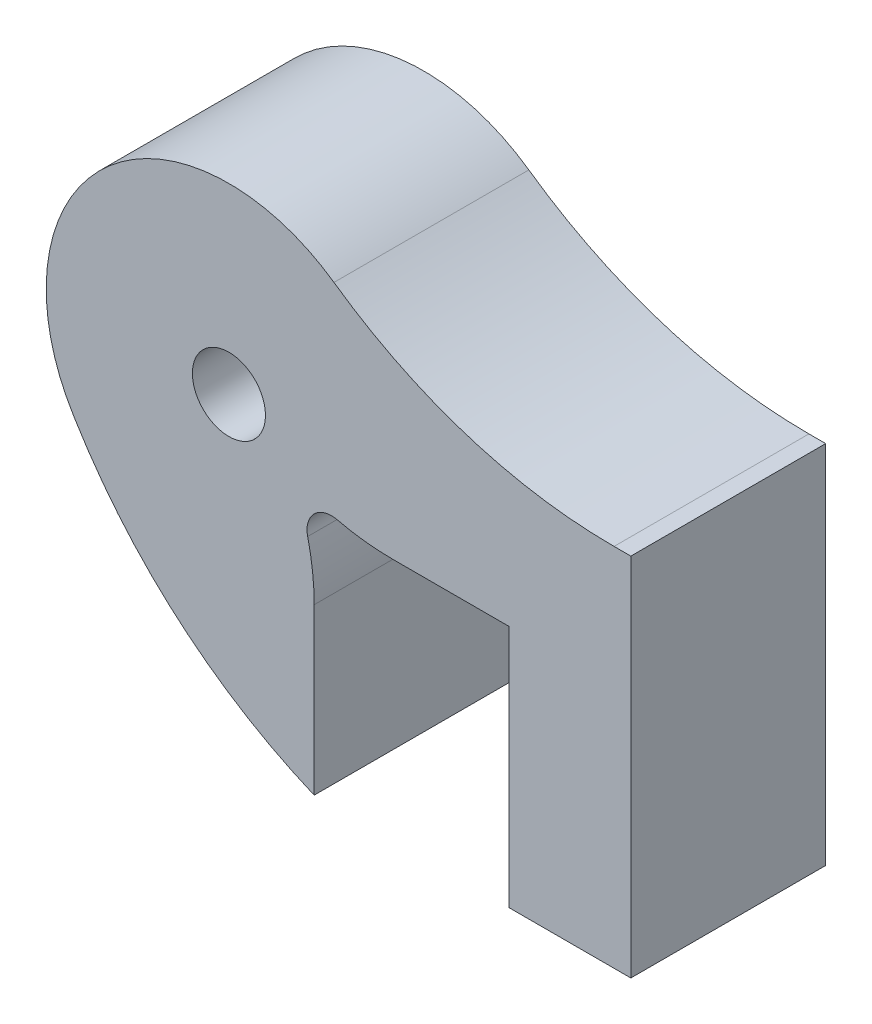
ISO-10303-21;
HEADER;
FILE_DESCRIPTION(('STEP AP214'),'2;1');
FILE_NAME('part.step','',(''),(''),'','','');
FILE_SCHEMA(('AUTOMOTIVE_DESIGN { 1 0 10303 214 1 1 1 1 }'));
ENDSEC;
DATA;
#1=APPLICATION_CONTEXT('core data for automotive mechanical design processes');
#2=APPLICATION_PROTOCOL_DEFINITION('international standard','automotive_design',2000,#1);
#3=PRODUCT_CONTEXT('',#1,'mechanical');
#4=PRODUCT('Part','Part','',(#3));
#5=PRODUCT_RELATED_PRODUCT_CATEGORY('part','',(#4));
#6=PRODUCT_DEFINITION_FORMATION('','',#4);
#7=PRODUCT_DEFINITION_CONTEXT('part definition',#1,'design');
#8=PRODUCT_DEFINITION('design','',#6,#7);
#9=PRODUCT_DEFINITION_SHAPE('','',#8);
#10=(LENGTH_UNIT() NAMED_UNIT(*) SI_UNIT(.MILLI.,.METRE.));
#11=(NAMED_UNIT(*) PLANE_ANGLE_UNIT() SI_UNIT($,.RADIAN.));
#12=(NAMED_UNIT(*) SI_UNIT($,.STERADIAN.) SOLID_ANGLE_UNIT());
#13=UNCERTAINTY_MEASURE_WITH_UNIT(LENGTH_MEASURE(1.E-05),#10,'distance_accuracy_value','');
#14=(GEOMETRIC_REPRESENTATION_CONTEXT(3) GLOBAL_UNCERTAINTY_ASSIGNED_CONTEXT((#13)) GLOBAL_UNIT_ASSIGNED_CONTEXT((#10,
#11,#12)) REPRESENTATION_CONTEXT('',''));
#15=CARTESIAN_POINT('',(0.,0.,0.));
#16=DIRECTION('',(0.,0.,1.));
#17=DIRECTION('',(1.,0.,0.));
#18=AXIS2_PLACEMENT_3D('',#15,#16,#17);
#19=CARTESIAN_POINT('',(20.,15.,8.));
#20=DIRECTION('',(0.,0.,1.));
#21=DIRECTION('',(1.,0.,0.));
#22=AXIS2_PLACEMENT_3D('',#19,#20,#21);
#23=PLANE('',#22);
#24=CARTESIAN_POINT('',(-19.9060472234872,-1.93630677742358,8.));
#25=DIRECTION('',(0.,0.,1.));
#26=DIRECTION('',(1.,0.,0.));
#27=AXIS2_PLACEMENT_3D('',#24,#25,#26);
#28=CIRCLE('',#27,20.);
#29=CARTESIAN_POINT('',(-2.88346742458743,8.56282542433902,8.));
#30=VERTEX_POINT('',#29);
#31=CARTESIAN_POINT('',(-2.81678935009272,8.4539417921066,8.));
#32=VERTEX_POINT('',#31);
#33=EDGE_CURVE('E203',#30,#32,#28,.F.);
#34=ORIENTED_EDGE('',*,*,#33,.T.);
#35=CARTESIAN_POINT('',(15.1269314169715,19.3637027901133,8.));
#36=DIRECTION('',(0.,0.,1.));
#37=DIRECTION('',(1.,0.,0.));
#38=AXIS2_PLACEMENT_3D('',#35,#36,#37);
#39=CIRCLE('',#38,21.);
#40=CARTESIAN_POINT('',(7.,0.,8.));
#41=VERTEX_POINT('',#40);
#42=EDGE_CURVE('E12',#32,#41,#39,.T.);
#43=ORIENTED_EDGE('',*,*,#42,.T.);
#44=DIRECTION('',(0.,1.,0.));
#45=VECTOR('',#44,1.);
#46=CARTESIAN_POINT('',(7.,0.,8.));
#47=LINE('',#46,#45);
#48=CARTESIAN_POINT('',(7.,6.77141262672688,8.));
#49=VERTEX_POINT('',#48);
#50=EDGE_CURVE('E153',#41,#49,#47,.T.);
#51=ORIENTED_EDGE('',*,*,#50,.T.);
#52=CARTESIAN_POINT('',(-3.,6.77141262672688,8.));
#53=DIRECTION('',(0.,0.,1.));
#54=DIRECTION('',(1.,0.,0.));
#55=AXIS2_PLACEMENT_3D('',#52,#53,#54);
#56=CIRCLE('',#55,10.);
#57=CARTESIAN_POINT('',(6.73373343744231,9.06366771044194,8.));
#58=VERTEX_POINT('',#57);
#59=EDGE_CURVE('E180',#49,#58,#56,.T.);
#60=ORIENTED_EDGE('',*,*,#59,.T.);
#61=CARTESIAN_POINT('',(7.70710678118654,9.29289321881345,8.));
#62=DIRECTION('',(0.,0.,1.));
#63=DIRECTION('',(1.,0.,0.));
#64=AXIS2_PLACEMENT_3D('',#61,#62,#63);
#65=CIRCLE('',#64,1.);
#66=CARTESIAN_POINT('',(7.93633228955805,10.2662665625577,8.));
#67=VERTEX_POINT('',#66);
#68=EDGE_CURVE('E219',#67,#58,#65,.T.);
#69=ORIENTED_EDGE('',*,*,#68,.F.);
#70=CARTESIAN_POINT('',(10.2285873732731,20.,8.));
#71=DIRECTION('',(0.,0.,1.));
#72=DIRECTION('',(1.,0.,0.));
#73=AXIS2_PLACEMENT_3D('',#70,#71,#72);
#74=CIRCLE('',#73,10.);
#75=CARTESIAN_POINT('',(10.2285873732731,10.,8.));
#76=VERTEX_POINT('',#75);
#77=EDGE_CURVE('E172',#67,#76,#74,.T.);
#78=ORIENTED_EDGE('',*,*,#77,.T.);
#79=DIRECTION('',(1.,0.,0.));
#80=VECTOR('',#79,1.);
#81=CARTESIAN_POINT('',(15.,10.,8.));
#82=LINE('',#81,#80);
#83=CARTESIAN_POINT('',(15.,10.,8.));
#84=VERTEX_POINT('',#83);
#85=EDGE_CURVE('E264',#76,#84,#82,.T.);
#86=ORIENTED_EDGE('',*,*,#85,.T.);
#87=DIRECTION('',(0.,-1.,0.));
#88=VECTOR('',#87,1.);
#89=CARTESIAN_POINT('',(15.,0.,8.));
#90=LINE('',#89,#88);
#91=CARTESIAN_POINT('',(15.,0.,8.));
#92=VERTEX_POINT('',#91);
#93=EDGE_CURVE('E256',#84,#92,#90,.T.);
#94=ORIENTED_EDGE('',*,*,#93,.T.);
#95=DIRECTION('',(1.,0.,0.));
#96=VECTOR('',#95,1.);
#97=CARTESIAN_POINT('',(20.,0.,8.));
#98=LINE('',#97,#96);
#99=CARTESIAN_POINT('',(20.,0.,8.));
#100=VERTEX_POINT('',#99);
#101=EDGE_CURVE('E159',#92,#100,#98,.T.);
#102=ORIENTED_EDGE('',*,*,#101,.T.);
#103=DIRECTION('',(0.,1.,0.));
#104=VECTOR('',#103,1.);
#105=CARTESIAN_POINT('',(20.,0.,8.));
#106=LINE('',#105,#104);
#107=CARTESIAN_POINT('',(20.,15.,8.));
#108=VERTEX_POINT('',#107);
#109=EDGE_CURVE('E154',#100,#108,#106,.T.);
#110=ORIENTED_EDGE('',*,*,#109,.T.);
#111=DIRECTION('',(-1.,0.,0.));
#112=VECTOR('',#111,1.);
#113=CARTESIAN_POINT('',(20.,15.,8.));
#114=LINE('',#113,#112);
#115=CARTESIAN_POINT('',(19.3113883008419,15.,8.));
#116=VERTEX_POINT('',#115);
#117=EDGE_CURVE('E143',#108,#116,#114,.T.);
#118=ORIENTED_EDGE('',*,*,#117,.T.);
#119=CARTESIAN_POINT('',(19.3113883008419,35.,8.));
#120=DIRECTION('',(0.,0.,1.));
#121=DIRECTION('',(1.,0.,0.));
#122=AXIS2_PLACEMENT_3D('',#119,#120,#121);
#123=CIRCLE('',#122,20.);
#124=CARTESIAN_POINT('',(7.81219680932051,18.6363636363636,8.));
#125=VERTEX_POINT('',#124);
#126=EDGE_CURVE('E199',#116,#125,#123,.F.);
#127=ORIENTED_EDGE('',*,*,#126,.T.);
#128=CARTESIAN_POINT('',(3.5,12.5,8.));
#129=DIRECTION('',(0.,0.,1.));
#130=DIRECTION('',(1.,0.,0.));
#131=AXIS2_PLACEMENT_3D('',#128,#129,#130);
#132=CIRCLE('',#131,7.5);
#133=EDGE_CURVE('E220',#125,#30,#132,.T.);
#134=ORIENTED_EDGE('',*,*,#133,.T.);
#135=EDGE_LOOP('',(#34,#43,#51,#60,#69,#78,#86,#94,#102,#110,#118,#127,#134));
#136=FACE_BOUND('',#135,.T.);
#137=CARTESIAN_POINT('',(3.5,12.5,8.));
#138=DIRECTION('',(0.,0.,1.));
#139=DIRECTION('',(1.,0.,0.));
#140=AXIS2_PLACEMENT_3D('',#137,#138,#139);
#141=CIRCLE('',#140,1.5);
#142=CARTESIAN_POINT('',(5.,12.5,8.));
#143=VERTEX_POINT('',#142);
#144=EDGE_CURVE('E267',#143,#143,#141,.T.);
#145=ORIENTED_EDGE('',*,*,#144,.F.);
#146=EDGE_LOOP('',(#145));
#147=FACE_BOUND('',#146,.T.);
#148=ADVANCED_FACE('F49',(#136,#147),#23,.T.);
#149=CARTESIAN_POINT('',(20.,15.,0.));
#150=DIRECTION('',(0.,0.,1.));
#151=DIRECTION('',(1.,0.,0.));
#152=AXIS2_PLACEMENT_3D('',#149,#150,#151);
#153=PLANE('',#152);
#154=DIRECTION('',(0.,1.,0.));
#155=VECTOR('',#154,1.);
#156=CARTESIAN_POINT('',(7.,0.,0.));
#157=LINE('',#156,#155);
#158=CARTESIAN_POINT('',(7.,0.,0.));
#159=VERTEX_POINT('',#158);
#160=CARTESIAN_POINT('',(7.,6.77141262672688,0.));
#161=VERTEX_POINT('',#160);
#162=EDGE_CURVE('E231',#159,#161,#157,.T.);
#163=ORIENTED_EDGE('',*,*,#162,.F.);
#164=CARTESIAN_POINT('',(15.1269314169715,19.3637027901133,0.));
#165=DIRECTION('',(0.,0.,1.));
#166=DIRECTION('',(1.,0.,0.));
#167=AXIS2_PLACEMENT_3D('',#164,#165,#166);
#168=CIRCLE('',#167,21.);
#169=CARTESIAN_POINT('',(-2.81678935009272,8.4539417921066,0.));
#170=VERTEX_POINT('',#169);
#171=EDGE_CURVE('E71',#159,#170,#168,.F.);
#172=ORIENTED_EDGE('',*,*,#171,.T.);
#173=CARTESIAN_POINT('',(-19.9060472234872,-1.93630677742358,0.));
#174=DIRECTION('',(0.,0.,1.));
#175=DIRECTION('',(1.,0.,0.));
#176=AXIS2_PLACEMENT_3D('',#173,#174,#175);
#177=CIRCLE('',#176,20.);
#178=CARTESIAN_POINT('',(-2.88346742458743,8.56282542433902,0.));
#179=VERTEX_POINT('',#178);
#180=EDGE_CURVE('E205',#170,#179,#177,.T.);
#181=ORIENTED_EDGE('',*,*,#180,.T.);
#182=CARTESIAN_POINT('',(3.5,12.5,0.));
#183=DIRECTION('',(0.,0.,1.));
#184=DIRECTION('',(1.,0.,0.));
#185=AXIS2_PLACEMENT_3D('',#182,#183,#184);
#186=CIRCLE('',#185,7.5);
#187=CARTESIAN_POINT('',(7.81219680932051,18.6363636363636,0.));
#188=VERTEX_POINT('',#187);
#189=EDGE_CURVE('E211',#188,#179,#186,.T.);
#190=ORIENTED_EDGE('',*,*,#189,.F.);
#191=CARTESIAN_POINT('',(19.3113883008419,35.,0.));
#192=DIRECTION('',(0.,0.,1.));
#193=DIRECTION('',(1.,0.,0.));
#194=AXIS2_PLACEMENT_3D('',#191,#192,#193);
#195=CIRCLE('',#194,20.);
#196=CARTESIAN_POINT('',(19.3113883008419,15.,0.));
#197=VERTEX_POINT('',#196);
#198=EDGE_CURVE('E201',#188,#197,#195,.T.);
#199=ORIENTED_EDGE('',*,*,#198,.T.);
#200=DIRECTION('',(-1.,0.,0.));
#201=VECTOR('',#200,1.);
#202=CARTESIAN_POINT('',(20.,15.,0.));
#203=LINE('',#202,#201);
#204=CARTESIAN_POINT('',(20.,15.,0.));
#205=VERTEX_POINT('',#204);
#206=EDGE_CURVE('E236',#205,#197,#203,.T.);
#207=ORIENTED_EDGE('',*,*,#206,.F.);
#208=DIRECTION('',(0.,1.,0.));
#209=VECTOR('',#208,1.);
#210=CARTESIAN_POINT('',(20.,0.,0.));
#211=LINE('',#210,#209);
#212=CARTESIAN_POINT('',(20.,0.,0.));
#213=VERTEX_POINT('',#212);
#214=EDGE_CURVE('E167',#213,#205,#211,.T.);
#215=ORIENTED_EDGE('',*,*,#214,.F.);
#216=DIRECTION('',(1.,0.,0.));
#217=VECTOR('',#216,1.);
#218=CARTESIAN_POINT('',(20.,0.,0.));
#219=LINE('',#218,#217);
#220=CARTESIAN_POINT('',(15.,0.,0.));
#221=VERTEX_POINT('',#220);
#222=EDGE_CURVE('E163',#221,#213,#219,.T.);
#223=ORIENTED_EDGE('',*,*,#222,.F.);
#224=DIRECTION('',(0.,-1.,0.));
#225=VECTOR('',#224,1.);
#226=CARTESIAN_POINT('',(15.,0.,0.));
#227=LINE('',#226,#225);
#228=CARTESIAN_POINT('',(15.,10.,0.));
#229=VERTEX_POINT('',#228);
#230=EDGE_CURVE('E238',#229,#221,#227,.T.);
#231=ORIENTED_EDGE('',*,*,#230,.F.);
#232=DIRECTION('',(1.,0.,0.));
#233=VECTOR('',#232,1.);
#234=CARTESIAN_POINT('',(15.,10.,0.));
#235=LINE('',#234,#233);
#236=CARTESIAN_POINT('',(10.2285873732731,10.,0.));
#237=VERTEX_POINT('',#236);
#238=EDGE_CURVE('E235',#237,#229,#235,.T.);
#239=ORIENTED_EDGE('',*,*,#238,.F.);
#240=CARTESIAN_POINT('',(10.2285873732731,20.,0.));
#241=DIRECTION('',(0.,0.,1.));
#242=DIRECTION('',(1.,0.,0.));
#243=AXIS2_PLACEMENT_3D('',#240,#241,#242);
#244=CIRCLE('',#243,10.);
#245=CARTESIAN_POINT('',(7.93633228955805,10.2662665625577,0.));
#246=VERTEX_POINT('',#245);
#247=EDGE_CURVE('E186',#237,#246,#244,.F.);
#248=ORIENTED_EDGE('',*,*,#247,.T.);
#249=CARTESIAN_POINT('',(7.70710678118654,9.29289321881345,0.));
#250=DIRECTION('',(0.,0.,1.));
#251=DIRECTION('',(1.,0.,0.));
#252=AXIS2_PLACEMENT_3D('',#249,#250,#251);
#253=CIRCLE('',#252,1.);
#254=CARTESIAN_POINT('',(6.73373343744231,9.06366771044194,0.));
#255=VERTEX_POINT('',#254);
#256=EDGE_CURVE('E274',#246,#255,#253,.T.);
#257=ORIENTED_EDGE('',*,*,#256,.T.);
#258=CARTESIAN_POINT('',(-3.,6.77141262672688,0.));
#259=DIRECTION('',(0.,0.,1.));
#260=DIRECTION('',(1.,0.,0.));
#261=AXIS2_PLACEMENT_3D('',#258,#259,#260);
#262=CIRCLE('',#261,10.);
#263=EDGE_CURVE('E188',#255,#161,#262,.F.);
#264=ORIENTED_EDGE('',*,*,#263,.T.);
#265=EDGE_LOOP('',(#163,#172,#181,#190,#199,#207,#215,#223,#231,#239,#248,#257,#264));
#266=FACE_BOUND('',#265,.T.);
#267=CARTESIAN_POINT('',(3.5,12.5,0.));
#268=DIRECTION('',(0.,0.,1.));
#269=DIRECTION('',(1.,0.,0.));
#270=AXIS2_PLACEMENT_3D('',#267,#268,#269);
#271=CIRCLE('',#270,1.5);
#272=CARTESIAN_POINT('',(5.,12.5,0.));
#273=VERTEX_POINT('',#272);
#274=EDGE_CURVE('E269',#273,#273,#271,.T.);
#275=ORIENTED_EDGE('',*,*,#274,.T.);
#276=EDGE_LOOP('',(#275));
#277=FACE_BOUND('',#276,.T.);
#278=ADVANCED_FACE('F209',(#266,#277),#153,.F.);
#279=CARTESIAN_POINT('',(20.,0.,8.));
#280=DIRECTION('',(-1.,0.,0.));
#281=DIRECTION('',(0.,0.,1.));
#282=AXIS2_PLACEMENT_3D('',#279,#280,#281);
#283=PLANE('',#282);
#284=ORIENTED_EDGE('',*,*,#214,.T.);
#285=DIRECTION('',(0.,0.,-1.));
#286=VECTOR('',#285,1.);
#287=CARTESIAN_POINT('',(20.,15.,8.));
#288=LINE('',#287,#286);
#289=EDGE_CURVE('E148',#108,#205,#288,.T.);
#290=ORIENTED_EDGE('',*,*,#289,.F.);
#291=ORIENTED_EDGE('',*,*,#109,.F.);
#292=DIRECTION('',(0.,0.,-1.));
#293=VECTOR('',#292,1.);
#294=CARTESIAN_POINT('',(20.,0.,8.));
#295=LINE('',#294,#293);
#296=EDGE_CURVE('E245',#100,#213,#295,.T.);
#297=ORIENTED_EDGE('',*,*,#296,.T.);
#298=EDGE_LOOP('',(#284,#290,#291,#297));
#299=FACE_BOUND('',#298,.T.);
#300=ADVANCED_FACE('F165',(#299),#283,.F.);
#301=CARTESIAN_POINT('',(20.,15.,8.));
#302=DIRECTION('',(0.,-1.,0.));
#303=DIRECTION('',(0.,0.,-1.));
#304=AXIS2_PLACEMENT_3D('',#301,#302,#303);
#305=PLANE('',#304);
#306=ORIENTED_EDGE('',*,*,#206,.T.);
#307=DIRECTION('',(0.,0.,1.));
#308=VECTOR('',#307,1.);
#309=CARTESIAN_POINT('',(19.3113883008419,15.,8.));
#310=LINE('',#309,#308);
#311=EDGE_CURVE('E151',#197,#116,#310,.T.);
#312=ORIENTED_EDGE('',*,*,#311,.T.);
#313=ORIENTED_EDGE('',*,*,#117,.F.);
#314=ORIENTED_EDGE('',*,*,#289,.T.);
#315=EDGE_LOOP('',(#306,#312,#313,#314));
#316=FACE_BOUND('',#315,.T.);
#317=ADVANCED_FACE('F146',(#316),#305,.F.);
#318=CARTESIAN_POINT('',(7.,0.,8.));
#319=DIRECTION('',(-1.,0.,0.));
#320=DIRECTION('',(0.,0.,1.));
#321=AXIS2_PLACEMENT_3D('',#318,#319,#320);
#322=PLANE('',#321);
#323=ORIENTED_EDGE('',*,*,#162,.T.);
#324=DIRECTION('',(0.,0.,1.));
#325=VECTOR('',#324,1.);
#326=CARTESIAN_POINT('',(7.,6.77141262672688,8.));
#327=LINE('',#326,#325);
#328=EDGE_CURVE('E168',#161,#49,#327,.T.);
#329=ORIENTED_EDGE('',*,*,#328,.T.);
#330=ORIENTED_EDGE('',*,*,#50,.F.);
#331=DIRECTION('',(0.,0.,-1.));
#332=VECTOR('',#331,1.);
#333=CARTESIAN_POINT('',(7.,0.,8.));
#334=LINE('',#333,#332);
#335=EDGE_CURVE('E169',#41,#159,#334,.T.);
#336=ORIENTED_EDGE('',*,*,#335,.T.);
#337=EDGE_LOOP('',(#323,#329,#330,#336));
#338=FACE_BOUND('',#337,.T.);
#339=ADVANCED_FACE('F230',(#338),#322,.F.);
#340=CARTESIAN_POINT('',(15.,10.,8.));
#341=DIRECTION('',(0.,1.,0.));
#342=DIRECTION('',(-1.,0.,0.));
#343=AXIS2_PLACEMENT_3D('',#340,#341,#342);
#344=PLANE('',#343);
#345=ORIENTED_EDGE('',*,*,#85,.F.);
#346=DIRECTION('',(0.,0.,1.));
#347=VECTOR('',#346,1.);
#348=CARTESIAN_POINT('',(10.2285873732731,10.,8.));
#349=LINE('',#348,#347);
#350=EDGE_CURVE('E190',#76,#237,#349,.F.);
#351=ORIENTED_EDGE('',*,*,#350,.T.);
#352=ORIENTED_EDGE('',*,*,#238,.T.);
#353=DIRECTION('',(0.,0.,-1.));
#354=VECTOR('',#353,1.);
#355=CARTESIAN_POINT('',(15.,10.,8.));
#356=LINE('',#355,#354);
#357=EDGE_CURVE('E175',#84,#229,#356,.T.);
#358=ORIENTED_EDGE('',*,*,#357,.F.);
#359=EDGE_LOOP('',(#345,#351,#352,#358));
#360=FACE_BOUND('',#359,.T.);
#361=ADVANCED_FACE('F282',(#360),#344,.F.);
#362=CARTESIAN_POINT('',(15.,0.,8.));
#363=DIRECTION('',(1.,0.,0.));
#364=DIRECTION('',(0.,1.,0.));
#365=AXIS2_PLACEMENT_3D('',#362,#363,#364);
#366=PLANE('',#365);
#367=ORIENTED_EDGE('',*,*,#230,.T.);
#368=DIRECTION('',(0.,0.,-1.));
#369=VECTOR('',#368,1.);
#370=CARTESIAN_POINT('',(15.,0.,8.));
#371=LINE('',#370,#369);
#372=EDGE_CURVE('E247',#92,#221,#371,.T.);
#373=ORIENTED_EDGE('',*,*,#372,.F.);
#374=ORIENTED_EDGE('',*,*,#93,.F.);
#375=ORIENTED_EDGE('',*,*,#357,.T.);
#376=EDGE_LOOP('',(#367,#373,#374,#375));
#377=FACE_BOUND('',#376,.T.);
#378=ADVANCED_FACE('F254',(#377),#366,.F.);
#379=CARTESIAN_POINT('',(20.,0.,8.));
#380=DIRECTION('',(0.,1.,0.));
#381=DIRECTION('',(-1.,0.,0.));
#382=AXIS2_PLACEMENT_3D('',#379,#380,#381);
#383=PLANE('',#382);
#384=ORIENTED_EDGE('',*,*,#222,.T.);
#385=ORIENTED_EDGE('',*,*,#296,.F.);
#386=ORIENTED_EDGE('',*,*,#101,.F.);
#387=ORIENTED_EDGE('',*,*,#372,.T.);
#388=EDGE_LOOP('',(#384,#385,#386,#387));
#389=FACE_BOUND('',#388,.T.);
#390=ADVANCED_FACE('F262',(#389),#383,.F.);
#391=CARTESIAN_POINT('',(3.5,12.5,8.));
#392=DIRECTION('',(0.,0.,-1.));
#393=DIRECTION('',(-1.,0.,0.));
#394=AXIS2_PLACEMENT_3D('',#391,#392,#393);
#395=CYLINDRICAL_SURFACE('',#394,1.5);
#396=ORIENTED_EDGE('',*,*,#144,.T.);
#397=EDGE_LOOP('',(#396));
#398=FACE_BOUND('',#397,.T.);
#399=ORIENTED_EDGE('',*,*,#274,.F.);
#400=EDGE_LOOP('',(#399));
#401=FACE_BOUND('',#400,.T.);
#402=ADVANCED_FACE('F301',(#398,#401),#395,.F.);
#403=CARTESIAN_POINT('',(7.70710678118654,9.29289321881345,0.));
#404=DIRECTION('',(0.,0.,1.));
#405=DIRECTION('',(1.,0.,0.));
#406=AXIS2_PLACEMENT_3D('',#403,#404,#405);
#407=CYLINDRICAL_SURFACE('',#406,1.);
#408=ORIENTED_EDGE('',*,*,#68,.T.);
#409=DIRECTION('',(0.,0.,1.));
#410=VECTOR('',#409,1.);
#411=CARTESIAN_POINT('',(6.73373343744231,9.06366771044194,0.));
#412=LINE('',#411,#410);
#413=EDGE_CURVE('E184',#58,#255,#412,.F.);
#414=ORIENTED_EDGE('',*,*,#413,.T.);
#415=ORIENTED_EDGE('',*,*,#256,.F.);
#416=DIRECTION('',(0.,0.,1.));
#417=VECTOR('',#416,1.);
#418=CARTESIAN_POINT('',(7.93633228955805,10.2662665625577,0.));
#419=LINE('',#418,#417);
#420=EDGE_CURVE('E182',#246,#67,#419,.T.);
#421=ORIENTED_EDGE('',*,*,#420,.T.);
#422=EDGE_LOOP('',(#408,#414,#415,#421));
#423=FACE_BOUND('',#422,.T.);
#424=ADVANCED_FACE('F289',(#423),#407,.F.);
#425=CARTESIAN_POINT('',(-3.,6.77141262672688,0.));
#426=DIRECTION('',(0.,0.,1.));
#427=DIRECTION('',(1.,0.,0.));
#428=AXIS2_PLACEMENT_3D('',#425,#426,#427);
#429=CYLINDRICAL_SURFACE('',#428,10.);
#430=ORIENTED_EDGE('',*,*,#263,.F.);
#431=ORIENTED_EDGE('',*,*,#413,.F.);
#432=ORIENTED_EDGE('',*,*,#59,.F.);
#433=ORIENTED_EDGE('',*,*,#328,.F.);
#434=EDGE_LOOP('',(#430,#431,#432,#433));
#435=FACE_BOUND('',#434,.T.);
#436=ADVANCED_FACE('F293',(#435),#429,.T.);
#437=CARTESIAN_POINT('',(10.2285873732731,20.,0.));
#438=DIRECTION('',(0.,0.,1.));
#439=DIRECTION('',(1.,0.,0.));
#440=AXIS2_PLACEMENT_3D('',#437,#438,#439);
#441=CYLINDRICAL_SURFACE('',#440,10.);
#442=ORIENTED_EDGE('',*,*,#77,.F.);
#443=ORIENTED_EDGE('',*,*,#420,.F.);
#444=ORIENTED_EDGE('',*,*,#247,.F.);
#445=ORIENTED_EDGE('',*,*,#350,.F.);
#446=EDGE_LOOP('',(#442,#443,#444,#445));
#447=FACE_BOUND('',#446,.T.);
#448=ADVANCED_FACE('F284',(#447),#441,.T.);
#449=CARTESIAN_POINT('',(3.5,12.5,0.));
#450=DIRECTION('',(0.,0.,1.));
#451=DIRECTION('',(1.,0.,0.));
#452=AXIS2_PLACEMENT_3D('',#449,#450,#451);
#453=CYLINDRICAL_SURFACE('',#452,7.5);
#454=ORIENTED_EDGE('',*,*,#133,.F.);
#455=DIRECTION('',(0.,0.,1.));
#456=VECTOR('',#455,1.);
#457=CARTESIAN_POINT('',(7.81219680932052,18.6363636363636,0.));
#458=LINE('',#457,#456);
#459=EDGE_CURVE('E197',#125,#188,#458,.F.);
#460=ORIENTED_EDGE('',*,*,#459,.T.);
#461=ORIENTED_EDGE('',*,*,#189,.T.);
#462=DIRECTION('',(0.,0.,1.));
#463=VECTOR('',#462,1.);
#464=CARTESIAN_POINT('',(-2.88346742458743,8.56282542433902,0.));
#465=LINE('',#464,#463);
#466=EDGE_CURVE('E194',#179,#30,#465,.T.);
#467=ORIENTED_EDGE('',*,*,#466,.T.);
#468=EDGE_LOOP('',(#454,#460,#461,#467));
#469=FACE_BOUND('',#468,.T.);
#470=ADVANCED_FACE('F216',(#469),#453,.T.);
#471=CARTESIAN_POINT('',(19.3113883008419,35.,0.));
#472=DIRECTION('',(0.,0.,1.));
#473=DIRECTION('',(1.,0.,0.));
#474=AXIS2_PLACEMENT_3D('',#471,#472,#473);
#475=CYLINDRICAL_SURFACE('',#474,20.);
#476=ORIENTED_EDGE('',*,*,#198,.F.);
#477=ORIENTED_EDGE('',*,*,#459,.F.);
#478=ORIENTED_EDGE('',*,*,#126,.F.);
#479=ORIENTED_EDGE('',*,*,#311,.F.);
#480=EDGE_LOOP('',(#476,#477,#478,#479));
#481=FACE_BOUND('',#480,.T.);
#482=ADVANCED_FACE('F376',(#481),#475,.F.);
#483=CARTESIAN_POINT('',(-19.9060472234872,-1.93630677742358,8.));
#484=DIRECTION('',(0.,0.,-1.));
#485=DIRECTION('',(-1.,0.,0.));
#486=AXIS2_PLACEMENT_3D('',#483,#484,#485);
#487=CYLINDRICAL_SURFACE('',#486,20.);
#488=ORIENTED_EDGE('',*,*,#180,.F.);
#489=DIRECTION('',(0.,0.,-1.));
#490=VECTOR('',#489,1.);
#491=CARTESIAN_POINT('',(-2.81678935009271,8.4539417921066,8.));
#492=LINE('',#491,#490);
#493=EDGE_CURVE('E57',#170,#32,#492,.F.);
#494=ORIENTED_EDGE('',*,*,#493,.T.);
#495=ORIENTED_EDGE('',*,*,#33,.F.);
#496=ORIENTED_EDGE('',*,*,#466,.F.);
#497=EDGE_LOOP('',(#488,#494,#495,#496));
#498=FACE_BOUND('',#497,.T.);
#499=ADVANCED_FACE('F222',(#498),#487,.F.);
#500=CARTESIAN_POINT('',(15.1269314169715,19.3637027901133,8.));
#501=DIRECTION('',(0.,0.,-1.));
#502=DIRECTION('',(-1.,0.,0.));
#503=AXIS2_PLACEMENT_3D('',#500,#501,#502);
#504=CYLINDRICAL_SURFACE('',#503,21.);
#505=ORIENTED_EDGE('',*,*,#42,.F.);
#506=ORIENTED_EDGE('',*,*,#493,.F.);
#507=ORIENTED_EDGE('',*,*,#171,.F.);
#508=ORIENTED_EDGE('',*,*,#335,.F.);
#509=EDGE_LOOP('',(#505,#506,#507,#508));
#510=FACE_BOUND('',#509,.T.);
#511=ADVANCED_FACE('F51',(#510),#504,.T.);
#512=CLOSED_SHELL('',(#148,#278,#300,#317,#339,#361,#378,#390,#402,#424,#436,#448,#470,#482,
#499,#511));
#513=MANIFOLD_SOLID_BREP('B2',#512);
#514=ADVANCED_BREP_SHAPE_REPRESENTATION('',(#18,#513),#14);
#515=SHAPE_DEFINITION_REPRESENTATION(#9,#514);
ENDSEC;
END-ISO-10303-21;
